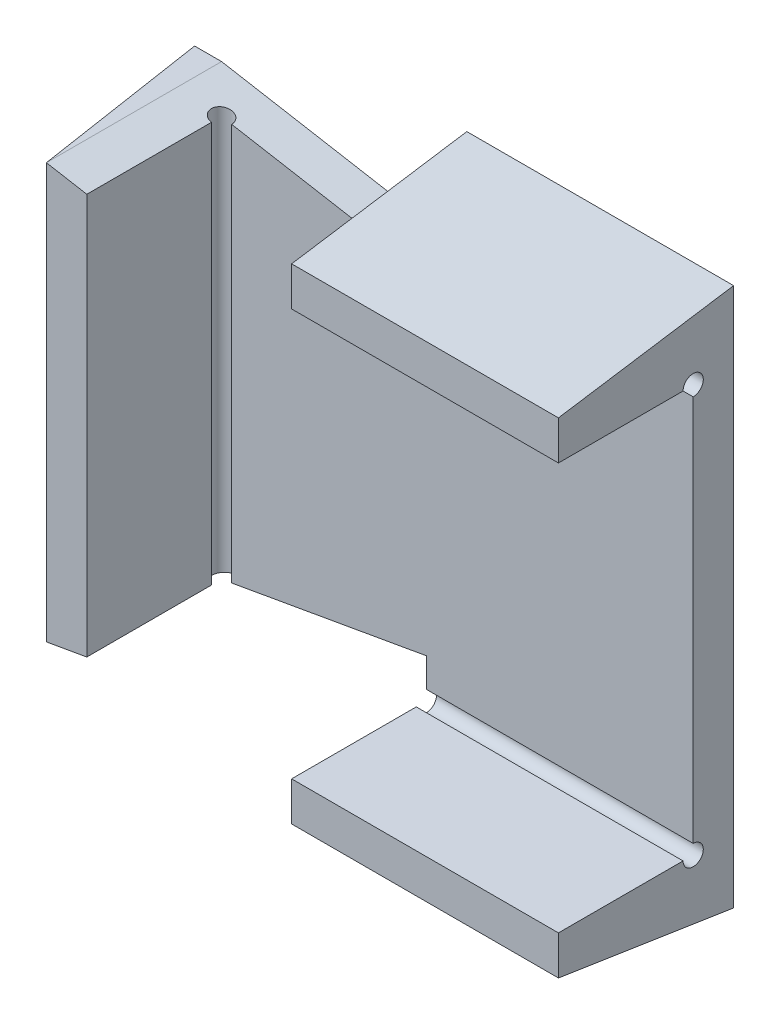
ISO-10303-21;
HEADER;
FILE_DESCRIPTION(('STEP AP214'),'2;1');
FILE_NAME('part.step','',(''),(''),'','','');
FILE_SCHEMA(('AUTOMOTIVE_DESIGN { 1 0 10303 214 1 1 1 1 }'));
ENDSEC;
DATA;
#1=APPLICATION_CONTEXT('core data for automotive mechanical design processes');
#2=APPLICATION_PROTOCOL_DEFINITION('international standard','automotive_design',2000,#1);
#3=PRODUCT_CONTEXT('',#1,'mechanical');
#4=PRODUCT('Part','Part','',(#3));
#5=PRODUCT_RELATED_PRODUCT_CATEGORY('part','',(#4));
#6=PRODUCT_DEFINITION_FORMATION('','',#4);
#7=PRODUCT_DEFINITION_CONTEXT('part definition',#1,'design');
#8=PRODUCT_DEFINITION('design','',#6,#7);
#9=PRODUCT_DEFINITION_SHAPE('','',#8);
#10=(LENGTH_UNIT() NAMED_UNIT(*) SI_UNIT(.MILLI.,.METRE.));
#11=(NAMED_UNIT(*) PLANE_ANGLE_UNIT() SI_UNIT($,.RADIAN.));
#12=(NAMED_UNIT(*) SI_UNIT($,.STERADIAN.) SOLID_ANGLE_UNIT());
#13=UNCERTAINTY_MEASURE_WITH_UNIT(LENGTH_MEASURE(1.E-05),#10,'distance_accuracy_value','');
#14=(GEOMETRIC_REPRESENTATION_CONTEXT(3) GLOBAL_UNCERTAINTY_ASSIGNED_CONTEXT((#13)) GLOBAL_UNIT_ASSIGNED_CONTEXT((#10,
#11,#12)) REPRESENTATION_CONTEXT('',''));
#15=CARTESIAN_POINT('',(0.,0.,0.));
#16=DIRECTION('',(0.,0.,1.));
#17=DIRECTION('',(1.,0.,0.));
#18=AXIS2_PLACEMENT_3D('',#15,#16,#17);
#19=CARTESIAN_POINT('',(0.,0.,13.));
#20=DIRECTION('',(0.,0.,-1.));
#21=DIRECTION('',(-1.,0.,0.));
#22=AXIS2_PLACEMENT_3D('',#19,#20,#21);
#23=PLANE('',#22);
#24=DIRECTION('',(0.,-1.,0.));
#25=VECTOR('',#24,1.);
#26=CARTESIAN_POINT('',(0.,0.,13.));
#27=LINE('',#26,#25);
#28=CARTESIAN_POINT('',(0.,33.4,13.));
#29=VERTEX_POINT('',#28);
#30=CARTESIAN_POINT('',(0.,2.6,13.));
#31=VERTEX_POINT('',#30);
#32=EDGE_CURVE('E272',#29,#31,#27,.T.);
#33=ORIENTED_EDGE('',*,*,#32,.T.);
#34=DIRECTION('',(0.984807753012208,0.173648177666931,0.));
#35=VECTOR('',#34,1.);
#36=CARTESIAN_POINT('',(0.,2.6,13.));
#37=LINE('',#36,#35);
#38=CARTESIAN_POINT('',(3.,3.1289809421254,13.));
#39=VERTEX_POINT('',#38);
#40=EDGE_CURVE('E231',#31,#39,#37,.T.);
#41=ORIENTED_EDGE('',*,*,#40,.T.);
#42=DIRECTION('',(0.,1.,0.));
#43=VECTOR('',#42,1.);
#44=CARTESIAN_POINT('',(3.,33.1,13.));
#45=LINE('',#44,#43);
#46=CARTESIAN_POINT('',(3.,32.8710190578746,13.));
#47=VERTEX_POINT('',#46);
#48=EDGE_CURVE('E283',#39,#47,#45,.T.);
#49=ORIENTED_EDGE('',*,*,#48,.T.);
#50=DIRECTION('',(-0.984807753012208,0.173648177666931,0.));
#51=VECTOR('',#50,1.);
#52=CARTESIAN_POINT('',(5.71173639353868,32.3928667671247,13.));
#53=LINE('',#52,#51);
#54=EDGE_CURVE('E298',#47,#29,#53,.T.);
#55=ORIENTED_EDGE('',*,*,#54,.T.);
#56=EDGE_LOOP('',(#33,#41,#49,#55));
#57=FACE_BOUND('',#56,.T.);
#58=ADVANCED_FACE('F33',(#57),#23,.F.);
#59=DIRECTION('',(-1.,0.,0.));
#60=VECTOR('',#59,1.);
#61=CARTESIAN_POINT('',(38.,2.9,13.));
#62=LINE('',#61,#60);
#63=CARTESIAN_POINT('',(38.,2.9,13.));
#64=VERTEX_POINT('',#63);
#65=CARTESIAN_POINT('',(18.2,2.9,13.));
#66=VERTEX_POINT('',#65);
#67=EDGE_CURVE('E280',#64,#66,#62,.T.);
#68=ORIENTED_EDGE('',*,*,#67,.T.);
#69=DIRECTION('',(0.,-1.,0.));
#70=VECTOR('',#69,1.);
#71=CARTESIAN_POINT('',(18.2,0.,13.));
#72=LINE('',#71,#70);
#73=CARTESIAN_POINT('',(18.2,0.,13.));
#74=VERTEX_POINT('',#73);
#75=EDGE_CURVE('E302',#66,#74,#72,.T.);
#76=ORIENTED_EDGE('',*,*,#75,.T.);
#77=DIRECTION('',(1.,0.,0.));
#78=VECTOR('',#77,1.);
#79=CARTESIAN_POINT('',(0.,0.,13.));
#80=LINE('',#79,#78);
#81=CARTESIAN_POINT('',(38.,0.,13.));
#82=VERTEX_POINT('',#81);
#83=EDGE_CURVE('E275',#74,#82,#80,.T.);
#84=ORIENTED_EDGE('',*,*,#83,.T.);
#85=DIRECTION('',(0.,1.,0.));
#86=VECTOR('',#85,1.);
#87=CARTESIAN_POINT('',(38.,0.,13.));
#88=LINE('',#87,#86);
#89=EDGE_CURVE('E278',#82,#64,#88,.T.);
#90=ORIENTED_EDGE('',*,*,#89,.T.);
#91=EDGE_LOOP('',(#68,#76,#84,#90));
#92=FACE_BOUND('',#91,.T.);
#93=ADVANCED_FACE('F327',(#92),#23,.F.);
#94=CARTESIAN_POINT('',(0.,0.,3.));
#95=DIRECTION('',(0.,0.,-1.));
#96=DIRECTION('',(-1.,0.,0.));
#97=AXIS2_PLACEMENT_3D('',#94,#95,#96);
#98=PLANE('',#97);
#99=DIRECTION('',(-0.984807753012208,0.173648177666931,0.));
#100=VECTOR('',#99,1.);
#101=CARTESIAN_POINT('',(5.71173639353868,32.3928667671247,3.));
#102=LINE('',#101,#100);
#103=CARTESIAN_POINT('',(18.2,30.1908489511059,3.));
#104=VERTEX_POINT('',#103);
#105=CARTESIAN_POINT('',(3.75,32.7387738223433,3.));
#106=VERTEX_POINT('',#105);
#107=EDGE_CURVE('E250',#104,#106,#102,.T.);
#108=ORIENTED_EDGE('',*,*,#107,.T.);
#109=DIRECTION('',(0.,-1.,0.));
#110=VECTOR('',#109,1.);
#111=CARTESIAN_POINT('',(3.75,36.,3.));
#112=LINE('',#111,#110);
#113=CARTESIAN_POINT('',(3.75,3.26122617765675,3.));
#114=VERTEX_POINT('',#113);
#115=EDGE_CURVE('E211',#106,#114,#112,.T.);
#116=ORIENTED_EDGE('',*,*,#115,.T.);
#117=DIRECTION('',(0.984807753012208,0.173648177666931,0.));
#118=VECTOR('',#117,1.);
#119=CARTESIAN_POINT('',(-0.44462618632337,2.52160040702168,3.));
#120=LINE('',#119,#118);
#121=CARTESIAN_POINT('',(18.2,5.80915104889407,3.));
#122=VERTEX_POINT('',#121);
#123=EDGE_CURVE('E264',#114,#122,#120,.T.);
#124=ORIENTED_EDGE('',*,*,#123,.T.);
#125=DIRECTION('',(0.,-1.,0.));
#126=VECTOR('',#125,1.);
#127=CARTESIAN_POINT('',(18.2,0.,3.));
#128=LINE('',#127,#126);
#129=CARTESIAN_POINT('',(18.2,3.65,3.));
#130=VERTEX_POINT('',#129);
#131=EDGE_CURVE('E256',#122,#130,#128,.T.);
#132=ORIENTED_EDGE('',*,*,#131,.T.);
#133=DIRECTION('',(1.,0.,0.));
#134=VECTOR('',#133,1.);
#135=CARTESIAN_POINT('',(16.0786796564404,3.65,3.));
#136=LINE('',#135,#134);
#137=CARTESIAN_POINT('',(38.,3.65,3.));
#138=VERTEX_POINT('',#137);
#139=EDGE_CURVE('E224',#130,#138,#136,.T.);
#140=ORIENTED_EDGE('',*,*,#139,.T.);
#141=DIRECTION('',(0.,1.,0.));
#142=VECTOR('',#141,1.);
#143=CARTESIAN_POINT('',(38.,0.,3.));
#144=LINE('',#143,#142);
#145=CARTESIAN_POINT('',(38.,32.35,3.));
#146=VERTEX_POINT('',#145);
#147=EDGE_CURVE('E295',#138,#146,#144,.T.);
#148=ORIENTED_EDGE('',*,*,#147,.T.);
#149=DIRECTION('',(1.,0.,0.));
#150=VECTOR('',#149,1.);
#151=CARTESIAN_POINT('',(16.0786796564404,32.35,3.));
#152=LINE('',#151,#150);
#153=CARTESIAN_POINT('',(18.2,32.35,3.));
#154=VERTEX_POINT('',#153);
#155=EDGE_CURVE('E228',#146,#154,#152,.F.);
#156=ORIENTED_EDGE('',*,*,#155,.T.);
#157=DIRECTION('',(0.,-1.,0.));
#158=VECTOR('',#157,1.);
#159=CARTESIAN_POINT('',(18.2,0.,3.));
#160=LINE('',#159,#158);
#161=EDGE_CURVE('E170',#154,#104,#160,.T.);
#162=ORIENTED_EDGE('',*,*,#161,.T.);
#163=EDGE_LOOP('',(#108,#116,#124,#132,#140,#148,#156,#162));
#164=FACE_BOUND('',#163,.T.);
#165=ADVANCED_FACE('F336',(#164),#98,.F.);
#166=CARTESIAN_POINT('',(38.,0.,3.));
#167=DIRECTION('',(-1.,0.,0.));
#168=DIRECTION('',(0.,0.,1.));
#169=AXIS2_PLACEMENT_3D('',#166,#167,#168);
#170=PLANE('',#169);
#171=ORIENTED_EDGE('',*,*,#147,.F.);
#172=CARTESIAN_POINT('',(38.,2.9,3.));
#173=DIRECTION('',(1.,0.,0.));
#174=DIRECTION('',(0.,0.,-1.));
#175=AXIS2_PLACEMENT_3D('',#172,#173,#174);
#176=CIRCLE('',#175,0.75);
#177=CARTESIAN_POINT('',(38.,2.9,3.75));
#178=VERTEX_POINT('',#177);
#179=EDGE_CURVE('E218',#178,#138,#176,.T.);
#180=ORIENTED_EDGE('',*,*,#179,.F.);
#181=DIRECTION('',(0.,0.,-1.));
#182=VECTOR('',#181,1.);
#183=CARTESIAN_POINT('',(38.,2.9,13.));
#184=LINE('',#183,#182);
#185=EDGE_CURVE('E291',#64,#178,#184,.T.);
#186=ORIENTED_EDGE('',*,*,#185,.F.);
#187=ORIENTED_EDGE('',*,*,#89,.F.);
#188=DIRECTION('',(0.,-0.152057184253941,-0.988371697650617));
#189=VECTOR('',#188,1.);
#190=CARTESIAN_POINT('',(38.,0.,13.));
#191=LINE('',#190,#189);
#192=CARTESIAN_POINT('',(38.,-2.,0.));
#193=VERTEX_POINT('',#192);
#194=EDGE_CURVE('E179',#82,#193,#191,.T.);
#195=ORIENTED_EDGE('',*,*,#194,.T.);
#196=DIRECTION('',(0.,1.,0.));
#197=VECTOR('',#196,1.);
#198=CARTESIAN_POINT('',(38.,0.,0.));
#199=LINE('',#198,#197);
#200=CARTESIAN_POINT('',(38.,38.,0.));
#201=VERTEX_POINT('',#200);
#202=EDGE_CURVE('E294',#193,#201,#199,.T.);
#203=ORIENTED_EDGE('',*,*,#202,.T.);
#204=DIRECTION('',(0.,-0.152057184253941,0.988371697650617));
#205=VECTOR('',#204,1.);
#206=CARTESIAN_POINT('',(38.,36.,13.));
#207=LINE('',#206,#205);
#208=CARTESIAN_POINT('',(38.,36.,13.));
#209=VERTEX_POINT('',#208);
#210=EDGE_CURVE('E178',#201,#209,#207,.T.);
#211=ORIENTED_EDGE('',*,*,#210,.T.);
#212=DIRECTION('',(0.,1.,0.));
#213=VECTOR('',#212,1.);
#214=CARTESIAN_POINT('',(38.,36.,13.));
#215=LINE('',#214,#213);
#216=CARTESIAN_POINT('',(38.,33.1,13.));
#217=VERTEX_POINT('',#216);
#218=EDGE_CURVE('E268',#217,#209,#215,.T.);
#219=ORIENTED_EDGE('',*,*,#218,.F.);
#220=DIRECTION('',(0.,0.,-1.));
#221=VECTOR('',#220,1.);
#222=CARTESIAN_POINT('',(38.,33.1,13.));
#223=LINE('',#222,#221);
#224=CARTESIAN_POINT('',(38.,33.1,3.75));
#225=VERTEX_POINT('',#224);
#226=EDGE_CURVE('E288',#217,#225,#223,.T.);
#227=ORIENTED_EDGE('',*,*,#226,.T.);
#228=CARTESIAN_POINT('',(38.,33.1,3.));
#229=DIRECTION('',(1.,0.,0.));
#230=DIRECTION('',(0.,0.,-1.));
#231=AXIS2_PLACEMENT_3D('',#228,#229,#230);
#232=CIRCLE('',#231,0.75);
#233=EDGE_CURVE('E217',#146,#225,#232,.T.);
#234=ORIENTED_EDGE('',*,*,#233,.F.);
#235=EDGE_LOOP('',(#171,#180,#186,#187,#195,#203,#211,#219,#227,#234));
#236=FACE_BOUND('',#235,.T.);
#237=ADVANCED_FACE('F35',(#236),#170,.F.);
#238=CARTESIAN_POINT('',(0.,0.,0.));
#239=DIRECTION('',(0.,0.,-1.));
#240=DIRECTION('',(-1.,0.,0.));
#241=AXIS2_PLACEMENT_3D('',#238,#239,#240);
#242=PLANE('',#241);
#243=DIRECTION('',(0.984807753012208,0.173648177666931,0.));
#244=VECTOR('',#243,1.);
#245=CARTESIAN_POINT('',(-0.44462618632337,2.52160040702168,0.));
#246=LINE('',#245,#244);
#247=CARTESIAN_POINT('',(0.,2.6,0.));
#248=VERTEX_POINT('',#247);
#249=CARTESIAN_POINT('',(18.2,5.80915104889407,0.));
#250=VERTEX_POINT('',#249);
#251=EDGE_CURVE('E266',#248,#250,#246,.T.);
#252=ORIENTED_EDGE('',*,*,#251,.F.);
#253=DIRECTION('',(1.,0.,0.));
#254=VECTOR('',#253,1.);
#255=CARTESIAN_POINT('',(-2.,2.6,0.));
#256=LINE('',#255,#254);
#257=CARTESIAN_POINT('',(-2.,2.6,0.));
#258=VERTEX_POINT('',#257);
#259=EDGE_CURVE('E197',#258,#248,#256,.T.);
#260=ORIENTED_EDGE('',*,*,#259,.F.);
#261=DIRECTION('',(0.,-1.,0.));
#262=VECTOR('',#261,1.);
#263=CARTESIAN_POINT('',(-2.,33.4,0.));
#264=LINE('',#263,#262);
#265=CARTESIAN_POINT('',(-2.,33.4,0.));
#266=VERTEX_POINT('',#265);
#267=EDGE_CURVE('E204',#266,#258,#264,.T.);
#268=ORIENTED_EDGE('',*,*,#267,.F.);
#269=DIRECTION('',(1.,0.,0.));
#270=VECTOR('',#269,1.);
#271=CARTESIAN_POINT('',(-2.,33.4,0.));
#272=LINE('',#271,#270);
#273=CARTESIAN_POINT('',(0.,33.4,0.));
#274=VERTEX_POINT('',#273);
#275=EDGE_CURVE('E198',#266,#274,#272,.T.);
#276=ORIENTED_EDGE('',*,*,#275,.T.);
#277=DIRECTION('',(-0.984807753012208,0.173648177666931,0.));
#278=VECTOR('',#277,1.);
#279=CARTESIAN_POINT('',(5.71173639353868,32.3928667671247,0.));
#280=LINE('',#279,#278);
#281=CARTESIAN_POINT('',(18.2,30.1908489511059,0.));
#282=VERTEX_POINT('',#281);
#283=EDGE_CURVE('E164',#282,#274,#280,.T.);
#284=ORIENTED_EDGE('',*,*,#283,.F.);
#285=DIRECTION('',(0.,-1.,0.));
#286=VECTOR('',#285,1.);
#287=CARTESIAN_POINT('',(18.2,0.,0.));
#288=LINE('',#287,#286);
#289=CARTESIAN_POINT('',(18.2,38.,0.));
#290=VERTEX_POINT('',#289);
#291=EDGE_CURVE('E157',#290,#282,#288,.T.);
#292=ORIENTED_EDGE('',*,*,#291,.F.);
#293=DIRECTION('',(1.,0.,0.));
#294=VECTOR('',#293,1.);
#295=CARTESIAN_POINT('',(18.2,38.,0.));
#296=LINE('',#295,#294);
#297=EDGE_CURVE('E161',#290,#201,#296,.T.);
#298=ORIENTED_EDGE('',*,*,#297,.T.);
#299=ORIENTED_EDGE('',*,*,#202,.F.);
#300=DIRECTION('',(1.,0.,0.));
#301=VECTOR('',#300,1.);
#302=CARTESIAN_POINT('',(18.2,-2.,0.));
#303=LINE('',#302,#301);
#304=CARTESIAN_POINT('',(18.2,-2.,0.));
#305=VERTEX_POINT('',#304);
#306=EDGE_CURVE('E192',#305,#193,#303,.T.);
#307=ORIENTED_EDGE('',*,*,#306,.F.);
#308=DIRECTION('',(0.,-1.,0.));
#309=VECTOR('',#308,1.);
#310=CARTESIAN_POINT('',(18.2,0.,0.));
#311=LINE('',#310,#309);
#312=EDGE_CURVE('E259',#250,#305,#311,.T.);
#313=ORIENTED_EDGE('',*,*,#312,.F.);
#314=EDGE_LOOP('',(#252,#260,#268,#276,#284,#292,#298,#299,#307,#313));
#315=FACE_BOUND('',#314,.T.);
#316=ADVANCED_FACE('F160',(#315),#242,.T.);
#317=CARTESIAN_POINT('',(38.,2.9,13.));
#318=DIRECTION('',(0.,-1.,0.));
#319=DIRECTION('',(1.,0.,0.));
#320=AXIS2_PLACEMENT_3D('',#317,#318,#319);
#321=PLANE('',#320);
#322=ORIENTED_EDGE('',*,*,#185,.T.);
#323=DIRECTION('',(1.,0.,0.));
#324=VECTOR('',#323,1.);
#325=CARTESIAN_POINT('',(16.0786796564404,2.9,3.75));
#326=LINE('',#325,#324);
#327=CARTESIAN_POINT('',(18.2,2.9,3.75));
#328=VERTEX_POINT('',#327);
#329=EDGE_CURVE('E220',#178,#328,#326,.F.);
#330=ORIENTED_EDGE('',*,*,#329,.T.);
#331=DIRECTION('',(0.,0.,1.));
#332=VECTOR('',#331,1.);
#333=CARTESIAN_POINT('',(18.2,2.9,13.));
#334=LINE('',#333,#332);
#335=EDGE_CURVE('E254',#328,#66,#334,.T.);
#336=ORIENTED_EDGE('',*,*,#335,.T.);
#337=ORIENTED_EDGE('',*,*,#67,.F.);
#338=EDGE_LOOP('',(#322,#330,#336,#337));
#339=FACE_BOUND('',#338,.T.);
#340=ADVANCED_FACE('F331',(#339),#321,.F.);
#341=CARTESIAN_POINT('',(3.,33.1,13.));
#342=DIRECTION('',(-1.,0.,0.));
#343=DIRECTION('',(0.,0.,1.));
#344=AXIS2_PLACEMENT_3D('',#341,#342,#343);
#345=PLANE('',#344);
#346=DIRECTION('',(0.,0.,-1.));
#347=VECTOR('',#346,1.);
#348=CARTESIAN_POINT('',(3.,3.12898094212539,13.));
#349=LINE('',#348,#347);
#350=CARTESIAN_POINT('',(3.,3.12898094212539,3.75));
#351=VERTEX_POINT('',#350);
#352=EDGE_CURVE('E261',#39,#351,#349,.T.);
#353=ORIENTED_EDGE('',*,*,#352,.T.);
#354=DIRECTION('',(0.,-1.,0.));
#355=VECTOR('',#354,1.);
#356=CARTESIAN_POINT('',(3.,36.,3.75));
#357=LINE('',#356,#355);
#358=CARTESIAN_POINT('',(3.,32.8710190578746,3.75));
#359=VERTEX_POINT('',#358);
#360=EDGE_CURVE('E48',#351,#359,#357,.F.);
#361=ORIENTED_EDGE('',*,*,#360,.T.);
#362=DIRECTION('',(0.,0.,1.));
#363=VECTOR('',#362,1.);
#364=CARTESIAN_POINT('',(3.,32.8710190578746,13.));
#365=LINE('',#364,#363);
#366=EDGE_CURVE('E169',#359,#47,#365,.T.);
#367=ORIENTED_EDGE('',*,*,#366,.T.);
#368=ORIENTED_EDGE('',*,*,#48,.F.);
#369=EDGE_LOOP('',(#353,#361,#367,#368));
#370=FACE_BOUND('',#369,.T.);
#371=ADVANCED_FACE('F359',(#370),#345,.F.);
#372=CARTESIAN_POINT('',(38.,33.1,13.));
#373=DIRECTION('',(0.,1.,0.));
#374=DIRECTION('',(-1.,0.,0.));
#375=AXIS2_PLACEMENT_3D('',#372,#373,#374);
#376=PLANE('',#375);
#377=DIRECTION('',(0.,0.,-1.));
#378=VECTOR('',#377,1.);
#379=CARTESIAN_POINT('',(18.2,33.1,13.));
#380=LINE('',#379,#378);
#381=CARTESIAN_POINT('',(18.2,33.1,13.));
#382=VERTEX_POINT('',#381);
#383=CARTESIAN_POINT('',(18.2,33.1,3.75));
#384=VERTEX_POINT('',#383);
#385=EDGE_CURVE('E238',#382,#384,#380,.T.);
#386=ORIENTED_EDGE('',*,*,#385,.T.);
#387=DIRECTION('',(1.,0.,0.));
#388=VECTOR('',#387,1.);
#389=CARTESIAN_POINT('',(16.0786796564404,33.1,3.75));
#390=LINE('',#389,#388);
#391=EDGE_CURVE('E55',#384,#225,#390,.T.);
#392=ORIENTED_EDGE('',*,*,#391,.T.);
#393=ORIENTED_EDGE('',*,*,#226,.F.);
#394=DIRECTION('',(1.,0.,0.));
#395=VECTOR('',#394,1.);
#396=CARTESIAN_POINT('',(38.,33.1,13.));
#397=LINE('',#396,#395);
#398=EDGE_CURVE('E286',#382,#217,#397,.T.);
#399=ORIENTED_EDGE('',*,*,#398,.F.);
#400=EDGE_LOOP('',(#386,#392,#393,#399));
#401=FACE_BOUND('',#400,.T.);
#402=ADVANCED_FACE('F309',(#401),#376,.F.);
#403=DIRECTION('',(-1.,0.,0.));
#404=VECTOR('',#403,1.);
#405=CARTESIAN_POINT('',(0.,36.,13.));
#406=LINE('',#405,#404);
#407=CARTESIAN_POINT('',(18.2,36.,13.));
#408=VERTEX_POINT('',#407);
#409=EDGE_CURVE('E270',#209,#408,#406,.T.);
#410=ORIENTED_EDGE('',*,*,#409,.T.);
#411=DIRECTION('',(0.,-1.,0.));
#412=VECTOR('',#411,1.);
#413=CARTESIAN_POINT('',(18.2,36.,13.));
#414=LINE('',#413,#412);
#415=EDGE_CURVE('E184',#408,#382,#414,.T.);
#416=ORIENTED_EDGE('',*,*,#415,.T.);
#417=ORIENTED_EDGE('',*,*,#398,.T.);
#418=ORIENTED_EDGE('',*,*,#218,.T.);
#419=EDGE_LOOP('',(#410,#416,#417,#418));
#420=FACE_BOUND('',#419,.T.);
#421=ADVANCED_FACE('F313',(#420),#23,.F.);
#422=CARTESIAN_POINT('',(0.,33.4,13.));
#423=DIRECTION('',(-0.173648177666931,-0.984807753012208,0.));
#424=DIRECTION('',(0.984807753012208,-0.173648177666931,0.));
#425=AXIS2_PLACEMENT_3D('',#422,#423,#424);
#426=PLANE('',#425);
#427=ORIENTED_EDGE('',*,*,#366,.F.);
#428=CARTESIAN_POINT('',(3.,32.8710190578746,3.));
#429=DIRECTION('',(-0.173648177666931,-0.984807753012208,0.));
#430=DIRECTION('',(0.984807753012208,-0.173648177666931,0.));
#431=AXIS2_PLACEMENT_3D('',#428,#429,#430);
#432=ELLIPSE('',#431,0.761569958914309,0.75);
#433=EDGE_CURVE('E214',#359,#106,#432,.T.);
#434=ORIENTED_EDGE('',*,*,#433,.T.);
#435=ORIENTED_EDGE('',*,*,#107,.F.);
#436=DIRECTION('',(0.,0.,-1.));
#437=VECTOR('',#436,1.);
#438=CARTESIAN_POINT('',(18.2,30.1908489511059,13.));
#439=LINE('',#438,#437);
#440=EDGE_CURVE('E242',#104,#282,#439,.T.);
#441=ORIENTED_EDGE('',*,*,#440,.T.);
#442=ORIENTED_EDGE('',*,*,#283,.T.);
#443=DIRECTION('',(0.,0.,-1.));
#444=VECTOR('',#443,1.);
#445=CARTESIAN_POINT('',(0.,33.4,13.));
#446=LINE('',#445,#444);
#447=EDGE_CURVE('E235',#29,#274,#446,.T.);
#448=ORIENTED_EDGE('',*,*,#447,.F.);
#449=ORIENTED_EDGE('',*,*,#54,.F.);
#450=EDGE_LOOP('',(#427,#434,#435,#441,#442,#448,#449));
#451=FACE_BOUND('',#450,.T.);
#452=ADVANCED_FACE('F355',(#451),#426,.F.);
#453=CARTESIAN_POINT('',(18.2,36.,13.));
#454=DIRECTION('',(1.,0.,0.));
#455=DIRECTION('',(0.,0.,-1.));
#456=AXIS2_PLACEMENT_3D('',#453,#454,#455);
#457=PLANE('',#456);
#458=ORIENTED_EDGE('',*,*,#161,.F.);
#459=CARTESIAN_POINT('',(18.2,33.1,3.));
#460=DIRECTION('',(1.,0.,0.));
#461=DIRECTION('',(0.,0.,-1.));
#462=AXIS2_PLACEMENT_3D('',#459,#460,#461);
#463=CIRCLE('',#462,0.75);
#464=EDGE_CURVE('E41',#154,#384,#463,.T.);
#465=ORIENTED_EDGE('',*,*,#464,.T.);
#466=ORIENTED_EDGE('',*,*,#385,.F.);
#467=ORIENTED_EDGE('',*,*,#415,.F.);
#468=DIRECTION('',(0.,-0.152057184253941,0.988371697650617));
#469=VECTOR('',#468,1.);
#470=CARTESIAN_POINT('',(18.2,36.,13.));
#471=LINE('',#470,#469);
#472=EDGE_CURVE('E176',#290,#408,#471,.T.);
#473=ORIENTED_EDGE('',*,*,#472,.F.);
#474=ORIENTED_EDGE('',*,*,#291,.T.);
#475=ORIENTED_EDGE('',*,*,#440,.F.);
#476=EDGE_LOOP('',(#458,#465,#466,#467,#473,#474,#475));
#477=FACE_BOUND('',#476,.T.);
#478=ADVANCED_FACE('F182',(#477),#457,.F.);
#479=CARTESIAN_POINT('',(0.,2.6,13.));
#480=DIRECTION('',(-0.173648177666931,0.984807753012208,0.));
#481=DIRECTION('',(-0.984807753012208,-0.173648177666931,0.));
#482=AXIS2_PLACEMENT_3D('',#479,#480,#481);
#483=PLANE('',#482);
#484=ORIENTED_EDGE('',*,*,#123,.F.);
#485=CARTESIAN_POINT('',(3.,3.12898094212539,3.));
#486=DIRECTION('',(-0.173648177666931,0.984807753012208,0.));
#487=DIRECTION('',(-0.984807753012208,-0.173648177666931,0.));
#488=AXIS2_PLACEMENT_3D('',#485,#486,#487);
#489=ELLIPSE('',#488,0.761569958914309,0.75);
#490=EDGE_CURVE('E11',#114,#351,#489,.T.);
#491=ORIENTED_EDGE('',*,*,#490,.T.);
#492=ORIENTED_EDGE('',*,*,#352,.F.);
#493=ORIENTED_EDGE('',*,*,#40,.F.);
#494=DIRECTION('',(0.,0.,-1.));
#495=VECTOR('',#494,1.);
#496=CARTESIAN_POINT('',(0.,2.6,13.));
#497=LINE('',#496,#495);
#498=EDGE_CURVE('E236',#31,#248,#497,.T.);
#499=ORIENTED_EDGE('',*,*,#498,.T.);
#500=ORIENTED_EDGE('',*,*,#251,.T.);
#501=DIRECTION('',(0.,0.,-1.));
#502=VECTOR('',#501,1.);
#503=CARTESIAN_POINT('',(18.2,5.80915104889407,13.));
#504=LINE('',#503,#502);
#505=EDGE_CURVE('E234',#122,#250,#504,.T.);
#506=ORIENTED_EDGE('',*,*,#505,.F.);
#507=EDGE_LOOP('',(#484,#491,#492,#493,#499,#500,#506));
#508=FACE_BOUND('',#507,.T.);
#509=ADVANCED_FACE('F339',(#508),#483,.F.);
#510=CARTESIAN_POINT('',(18.2,0.,13.));
#511=DIRECTION('',(1.,0.,0.));
#512=DIRECTION('',(0.,0.,-1.));
#513=AXIS2_PLACEMENT_3D('',#510,#511,#512);
#514=PLANE('',#513);
#515=ORIENTED_EDGE('',*,*,#335,.F.);
#516=CARTESIAN_POINT('',(18.2,2.9,3.));
#517=DIRECTION('',(1.,0.,0.));
#518=DIRECTION('',(0.,0.,-1.));
#519=AXIS2_PLACEMENT_3D('',#516,#517,#518);
#520=CIRCLE('',#519,0.75);
#521=EDGE_CURVE('E305',#328,#130,#520,.T.);
#522=ORIENTED_EDGE('',*,*,#521,.T.);
#523=ORIENTED_EDGE('',*,*,#131,.F.);
#524=ORIENTED_EDGE('',*,*,#505,.T.);
#525=ORIENTED_EDGE('',*,*,#312,.T.);
#526=DIRECTION('',(0.,-0.152057184253941,-0.988371697650617));
#527=VECTOR('',#526,1.);
#528=CARTESIAN_POINT('',(18.2,0.,13.));
#529=LINE('',#528,#527);
#530=EDGE_CURVE('E189',#74,#305,#529,.T.);
#531=ORIENTED_EDGE('',*,*,#530,.F.);
#532=ORIENTED_EDGE('',*,*,#75,.F.);
#533=EDGE_LOOP('',(#515,#522,#523,#524,#525,#531,#532));
#534=FACE_BOUND('',#533,.T.);
#535=ADVANCED_FACE('F325',(#534),#514,.F.);
#536=CARTESIAN_POINT('',(16.0786796564404,2.9,3.));
#537=DIRECTION('',(1.,0.,0.));
#538=DIRECTION('',(0.,0.,-1.));
#539=AXIS2_PLACEMENT_3D('',#536,#537,#538);
#540=CYLINDRICAL_SURFACE('',#539,0.75);
#541=ORIENTED_EDGE('',*,*,#521,.F.);
#542=ORIENTED_EDGE('',*,*,#329,.F.);
#543=ORIENTED_EDGE('',*,*,#179,.T.);
#544=ORIENTED_EDGE('',*,*,#139,.F.);
#545=EDGE_LOOP('',(#541,#542,#543,#544));
#546=FACE_BOUND('',#545,.T.);
#547=ADVANCED_FACE('F364',(#546),#540,.F.);
#548=CARTESIAN_POINT('',(16.0786796564404,33.1,3.));
#549=DIRECTION('',(1.,0.,0.));
#550=DIRECTION('',(0.,0.,-1.));
#551=AXIS2_PLACEMENT_3D('',#548,#549,#550);
#552=CYLINDRICAL_SURFACE('',#551,0.75);
#553=ORIENTED_EDGE('',*,*,#233,.T.);
#554=ORIENTED_EDGE('',*,*,#391,.F.);
#555=ORIENTED_EDGE('',*,*,#464,.F.);
#556=ORIENTED_EDGE('',*,*,#155,.F.);
#557=EDGE_LOOP('',(#553,#554,#555,#556));
#558=FACE_BOUND('',#557,.T.);
#559=ADVANCED_FACE('F362',(#558),#552,.F.);
#560=CARTESIAN_POINT('',(3.,36.,3.));
#561=DIRECTION('',(0.,-1.,0.));
#562=DIRECTION('',(0.,0.,-1.));
#563=AXIS2_PLACEMENT_3D('',#560,#561,#562);
#564=CYLINDRICAL_SURFACE('',#563,0.75);
#565=ORIENTED_EDGE('',*,*,#360,.F.);
#566=ORIENTED_EDGE('',*,*,#490,.F.);
#567=ORIENTED_EDGE('',*,*,#115,.F.);
#568=ORIENTED_EDGE('',*,*,#433,.F.);
#569=EDGE_LOOP('',(#565,#566,#567,#568));
#570=FACE_BOUND('',#569,.T.);
#571=ADVANCED_FACE('F371',(#570),#564,.F.);
#572=CARTESIAN_POINT('',(0.,33.4,13.));
#573=DIRECTION('',(-0.988371697650617,0.,0.152057184253941));
#574=DIRECTION('',(0.152057184253941,0.,0.988371697650617));
#575=AXIS2_PLACEMENT_3D('',#572,#573,#574);
#576=PLANE('',#575);
#577=DIRECTION('',(-0.152057184253941,0.,-0.988371697650617));
#578=VECTOR('',#577,1.);
#579=CARTESIAN_POINT('',(0.,2.6,13.));
#580=LINE('',#579,#578);
#581=EDGE_CURVE('E201',#31,#258,#580,.T.);
#582=ORIENTED_EDGE('',*,*,#581,.F.);
#583=ORIENTED_EDGE('',*,*,#32,.F.);
#584=DIRECTION('',(-0.152057184253941,0.,-0.988371697650617));
#585=VECTOR('',#584,1.);
#586=CARTESIAN_POINT('',(0.,33.4,13.));
#587=LINE('',#586,#585);
#588=EDGE_CURVE('E200',#29,#266,#587,.T.);
#589=ORIENTED_EDGE('',*,*,#588,.T.);
#590=ORIENTED_EDGE('',*,*,#267,.T.);
#591=EDGE_LOOP('',(#582,#583,#589,#590));
#592=FACE_BOUND('',#591,.T.);
#593=ADVANCED_FACE('F347',(#592),#576,.T.);
#594=CARTESIAN_POINT('',(0.,33.4,0.));
#595=DIRECTION('',(0.,-1.,0.));
#596=DIRECTION('',(0.,0.,-1.));
#597=AXIS2_PLACEMENT_3D('',#594,#595,#596);
#598=PLANE('',#597);
#599=ORIENTED_EDGE('',*,*,#275,.F.);
#600=ORIENTED_EDGE('',*,*,#588,.F.);
#601=ORIENTED_EDGE('',*,*,#447,.T.);
#602=EDGE_LOOP('',(#599,#600,#601));
#603=FACE_BOUND('',#602,.T.);
#604=ADVANCED_FACE('F351',(#603),#598,.F.);
#605=CARTESIAN_POINT('',(0.,2.6,0.));
#606=DIRECTION('',(0.,-1.,0.));
#607=DIRECTION('',(0.,0.,-1.));
#608=AXIS2_PLACEMENT_3D('',#605,#606,#607);
#609=PLANE('',#608);
#610=ORIENTED_EDGE('',*,*,#259,.T.);
#611=ORIENTED_EDGE('',*,*,#498,.F.);
#612=ORIENTED_EDGE('',*,*,#581,.T.);
#613=EDGE_LOOP('',(#610,#611,#612));
#614=FACE_BOUND('',#613,.T.);
#615=ADVANCED_FACE('F343',(#614),#609,.T.);
#616=CARTESIAN_POINT('',(18.2,0.,13.));
#617=DIRECTION('',(0.,-0.988371697650617,0.152057184253941));
#618=DIRECTION('',(0.,-0.152057184253941,-0.988371697650617));
#619=AXIS2_PLACEMENT_3D('',#616,#617,#618);
#620=PLANE('',#619);
#621=ORIENTED_EDGE('',*,*,#194,.F.);
#622=ORIENTED_EDGE('',*,*,#83,.F.);
#623=ORIENTED_EDGE('',*,*,#530,.T.);
#624=ORIENTED_EDGE('',*,*,#306,.T.);
#625=EDGE_LOOP('',(#621,#622,#623,#624));
#626=FACE_BOUND('',#625,.T.);
#627=ADVANCED_FACE('F320',(#626),#620,.T.);
#628=CARTESIAN_POINT('',(18.2,36.,13.));
#629=DIRECTION('',(0.,0.988371697650617,0.152057184253941));
#630=DIRECTION('',(0.,-0.152057184253941,0.988371697650617));
#631=AXIS2_PLACEMENT_3D('',#628,#629,#630);
#632=PLANE('',#631);
#633=ORIENTED_EDGE('',*,*,#210,.F.);
#634=ORIENTED_EDGE('',*,*,#297,.F.);
#635=ORIENTED_EDGE('',*,*,#472,.T.);
#636=ORIENTED_EDGE('',*,*,#409,.F.);
#637=EDGE_LOOP('',(#633,#634,#635,#636));
#638=FACE_BOUND('',#637,.T.);
#639=ADVANCED_FACE('F174',(#638),#632,.T.);
#640=CLOSED_SHELL('',(#58,#93,#165,#237,#316,#340,#371,#402,#421,#452,#478,#509,#535,#547,#559,
#571,#593,#604,#615,#627,#639));
#641=MANIFOLD_SOLID_BREP('B2',#640);
#642=ADVANCED_BREP_SHAPE_REPRESENTATION('',(#18,#641),#14);
#643=SHAPE_DEFINITION_REPRESENTATION(#9,#642);
ENDSEC;
END-ISO-10303-21;
